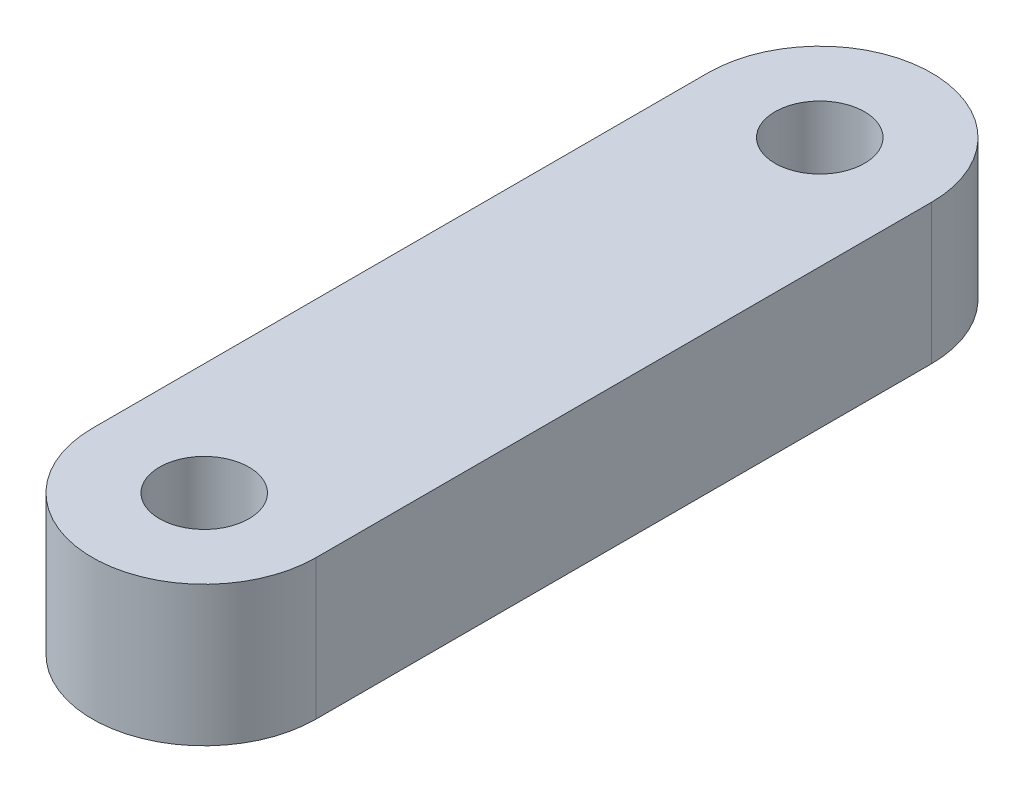
ISO-10303-21;
HEADER;
FILE_DESCRIPTION(('STEP AP214'),'2;1');
FILE_NAME('part.step','',(''),(''),'','','');
FILE_SCHEMA(('AUTOMOTIVE_DESIGN { 1 0 10303 214 1 1 1 1 }'));
ENDSEC;
DATA;
#1=APPLICATION_CONTEXT('core data for automotive mechanical design processes');
#2=APPLICATION_PROTOCOL_DEFINITION('international standard','automotive_design',2000,#1);
#3=PRODUCT_CONTEXT('',#1,'mechanical');
#4=PRODUCT('Part','Part','',(#3));
#5=PRODUCT_RELATED_PRODUCT_CATEGORY('part','',(#4));
#6=PRODUCT_DEFINITION_FORMATION('','',#4);
#7=PRODUCT_DEFINITION_CONTEXT('part definition',#1,'design');
#8=PRODUCT_DEFINITION('design','',#6,#7);
#9=PRODUCT_DEFINITION_SHAPE('','',#8);
#10=(LENGTH_UNIT() NAMED_UNIT(*) SI_UNIT(.MILLI.,.METRE.));
#11=(NAMED_UNIT(*) PLANE_ANGLE_UNIT() SI_UNIT($,.RADIAN.));
#12=(NAMED_UNIT(*) SI_UNIT($,.STERADIAN.) SOLID_ANGLE_UNIT());
#13=UNCERTAINTY_MEASURE_WITH_UNIT(LENGTH_MEASURE(1.E-05),#10,'distance_accuracy_value','');
#14=(GEOMETRIC_REPRESENTATION_CONTEXT(3) GLOBAL_UNCERTAINTY_ASSIGNED_CONTEXT((#13)) GLOBAL_UNIT_ASSIGNED_CONTEXT((#10,
#11,#12)) REPRESENTATION_CONTEXT('',''));
#15=CARTESIAN_POINT('',(0.,0.,0.));
#16=DIRECTION('',(0.,0.,1.));
#17=DIRECTION('',(1.,0.,0.));
#18=AXIS2_PLACEMENT_3D('',#15,#16,#17);
#19=CARTESIAN_POINT('',(0.,5.,11.));
#20=DIRECTION('',(0.,1.,0.));
#21=DIRECTION('',(0.,0.,1.));
#22=AXIS2_PLACEMENT_3D('',#19,#20,#21);
#23=PLANE('',#22);
#24=CARTESIAN_POINT('',(0.,5.,-11.));
#25=DIRECTION('',(0.,1.,0.));
#26=DIRECTION('',(0.,0.,1.));
#27=AXIS2_PLACEMENT_3D('',#24,#25,#26);
#28=CIRCLE('',#27,1.6);
#29=CARTESIAN_POINT('',(0.,5.,-9.4));
#30=VERTEX_POINT('',#29);
#31=EDGE_CURVE('E107',#30,#30,#28,.T.);
#32=ORIENTED_EDGE('',*,*,#31,.F.);
#33=EDGE_LOOP('',(#32));
#34=FACE_BOUND('',#33,.T.);
#35=CARTESIAN_POINT('',(0.,5.,11.));
#36=DIRECTION('',(0.,1.,0.));
#37=DIRECTION('',(0.,0.,1.));
#38=AXIS2_PLACEMENT_3D('',#35,#36,#37);
#39=CIRCLE('',#38,4.);
#40=CARTESIAN_POINT('',(-4.,5.,11.));
#41=VERTEX_POINT('',#40);
#42=CARTESIAN_POINT('',(4.,5.,11.));
#43=VERTEX_POINT('',#42);
#44=EDGE_CURVE('E92',#41,#43,#39,.T.);
#45=ORIENTED_EDGE('',*,*,#44,.T.);
#46=DIRECTION('',(0.,0.,-1.));
#47=VECTOR('',#46,1.);
#48=CARTESIAN_POINT('',(4.,5.,11.));
#49=LINE('',#48,#47);
#50=CARTESIAN_POINT('',(3.99999999999999,5.,-11.));
#51=VERTEX_POINT('',#50);
#52=EDGE_CURVE('E87',#43,#51,#49,.T.);
#53=ORIENTED_EDGE('',*,*,#52,.T.);
#54=CARTESIAN_POINT('',(0.,5.,-11.));
#55=DIRECTION('',(0.,1.,0.));
#56=DIRECTION('',(0.,0.,1.));
#57=AXIS2_PLACEMENT_3D('',#54,#55,#56);
#58=CIRCLE('',#57,3.99999999999999);
#59=CARTESIAN_POINT('',(-3.99999999999999,5.,-11.));
#60=VERTEX_POINT('',#59);
#61=EDGE_CURVE('E90',#51,#60,#58,.T.);
#62=ORIENTED_EDGE('',*,*,#61,.T.);
#63=DIRECTION('',(0.,0.,1.));
#64=VECTOR('',#63,1.);
#65=CARTESIAN_POINT('',(-4.,5.,11.));
#66=LINE('',#65,#64);
#67=EDGE_CURVE('E57',#60,#41,#66,.T.);
#68=ORIENTED_EDGE('',*,*,#67,.T.);
#69=EDGE_LOOP('',(#45,#53,#62,#68));
#70=FACE_BOUND('',#69,.T.);
#71=CARTESIAN_POINT('',(0.,5.,11.));
#72=DIRECTION('',(0.,1.,0.));
#73=DIRECTION('',(0.,0.,1.));
#74=AXIS2_PLACEMENT_3D('',#71,#72,#73);
#75=CIRCLE('',#74,1.6);
#76=CARTESIAN_POINT('',(0.,5.,12.6));
#77=VERTEX_POINT('',#76);
#78=EDGE_CURVE('E122',#77,#77,#75,.T.);
#79=ORIENTED_EDGE('',*,*,#78,.F.);
#80=EDGE_LOOP('',(#79));
#81=FACE_BOUND('',#80,.T.);
#82=ADVANCED_FACE('F40',(#34,#70,#81),#23,.T.);
#83=CARTESIAN_POINT('',(0.,0.,11.));
#84=DIRECTION('',(0.,1.,0.));
#85=DIRECTION('',(0.,0.,1.));
#86=AXIS2_PLACEMENT_3D('',#83,#84,#85);
#87=PLANE('',#86);
#88=CARTESIAN_POINT('',(0.,0.,11.));
#89=DIRECTION('',(0.,1.,0.));
#90=DIRECTION('',(0.,0.,1.));
#91=AXIS2_PLACEMENT_3D('',#88,#89,#90);
#92=CIRCLE('',#91,4.);
#93=CARTESIAN_POINT('',(-4.,0.,11.));
#94=VERTEX_POINT('',#93);
#95=CARTESIAN_POINT('',(4.,0.,11.));
#96=VERTEX_POINT('',#95);
#97=EDGE_CURVE('E104',#94,#96,#92,.T.);
#98=ORIENTED_EDGE('',*,*,#97,.F.);
#99=DIRECTION('',(0.,0.,1.));
#100=VECTOR('',#99,1.);
#101=CARTESIAN_POINT('',(-4.,0.,11.));
#102=LINE('',#101,#100);
#103=CARTESIAN_POINT('',(-3.99999999999999,0.,-11.));
#104=VERTEX_POINT('',#103);
#105=EDGE_CURVE('E80',#104,#94,#102,.T.);
#106=ORIENTED_EDGE('',*,*,#105,.F.);
#107=CARTESIAN_POINT('',(0.,0.,-11.));
#108=DIRECTION('',(0.,1.,0.));
#109=DIRECTION('',(0.,0.,1.));
#110=AXIS2_PLACEMENT_3D('',#107,#108,#109);
#111=CIRCLE('',#110,3.99999999999999);
#112=CARTESIAN_POINT('',(3.99999999999999,0.,-11.));
#113=VERTEX_POINT('',#112);
#114=EDGE_CURVE('E74',#113,#104,#111,.T.);
#115=ORIENTED_EDGE('',*,*,#114,.F.);
#116=DIRECTION('',(0.,0.,-1.));
#117=VECTOR('',#116,1.);
#118=CARTESIAN_POINT('',(4.,0.,11.));
#119=LINE('',#118,#117);
#120=EDGE_CURVE('E96',#96,#113,#119,.T.);
#121=ORIENTED_EDGE('',*,*,#120,.F.);
#122=EDGE_LOOP('',(#98,#106,#115,#121));
#123=FACE_BOUND('',#122,.T.);
#124=CARTESIAN_POINT('',(0.,0.,-11.));
#125=DIRECTION('',(0.,1.,0.));
#126=DIRECTION('',(0.,0.,1.));
#127=AXIS2_PLACEMENT_3D('',#124,#125,#126);
#128=CIRCLE('',#127,1.6);
#129=CARTESIAN_POINT('',(0.,0.,-9.4));
#130=VERTEX_POINT('',#129);
#131=EDGE_CURVE('E119',#130,#130,#128,.T.);
#132=ORIENTED_EDGE('',*,*,#131,.T.);
#133=EDGE_LOOP('',(#132));
#134=FACE_BOUND('',#133,.T.);
#135=CARTESIAN_POINT('',(0.,0.,11.));
#136=DIRECTION('',(0.,1.,0.));
#137=DIRECTION('',(0.,0.,1.));
#138=AXIS2_PLACEMENT_3D('',#135,#136,#137);
#139=CIRCLE('',#138,1.6);
#140=CARTESIAN_POINT('',(0.,0.,12.6));
#141=VERTEX_POINT('',#140);
#142=EDGE_CURVE('E125',#141,#141,#139,.T.);
#143=ORIENTED_EDGE('',*,*,#142,.T.);
#144=EDGE_LOOP('',(#143));
#145=FACE_BOUND('',#144,.T.);
#146=ADVANCED_FACE('F115',(#123,#134,#145),#87,.F.);
#147=CARTESIAN_POINT('',(0.,5.,11.));
#148=DIRECTION('',(0.,-1.,0.));
#149=DIRECTION('',(0.,0.,-1.));
#150=AXIS2_PLACEMENT_3D('',#147,#148,#149);
#151=CYLINDRICAL_SURFACE('',#150,4.);
#152=ORIENTED_EDGE('',*,*,#97,.T.);
#153=DIRECTION('',(0.,-1.,0.));
#154=VECTOR('',#153,1.);
#155=CARTESIAN_POINT('',(4.,5.,11.));
#156=LINE('',#155,#154);
#157=EDGE_CURVE('E11',#43,#96,#156,.T.);
#158=ORIENTED_EDGE('',*,*,#157,.F.);
#159=ORIENTED_EDGE('',*,*,#44,.F.);
#160=DIRECTION('',(0.,-1.,0.));
#161=VECTOR('',#160,1.);
#162=CARTESIAN_POINT('',(-4.,5.,11.));
#163=LINE('',#162,#161);
#164=EDGE_CURVE('E100',#41,#94,#163,.T.);
#165=ORIENTED_EDGE('',*,*,#164,.T.);
#166=EDGE_LOOP('',(#152,#158,#159,#165));
#167=FACE_BOUND('',#166,.T.);
#168=ADVANCED_FACE('F42',(#167),#151,.T.);
#169=CARTESIAN_POINT('',(4.,5.,11.));
#170=DIRECTION('',(-1.,0.,0.));
#171=DIRECTION('',(0.,0.,1.));
#172=AXIS2_PLACEMENT_3D('',#169,#170,#171);
#173=PLANE('',#172);
#174=ORIENTED_EDGE('',*,*,#120,.T.);
#175=DIRECTION('',(0.,-1.,0.));
#176=VECTOR('',#175,1.);
#177=CARTESIAN_POINT('',(3.99999999999999,5.,-11.));
#178=LINE('',#177,#176);
#179=EDGE_CURVE('E49',#51,#113,#178,.T.);
#180=ORIENTED_EDGE('',*,*,#179,.F.);
#181=ORIENTED_EDGE('',*,*,#52,.F.);
#182=ORIENTED_EDGE('',*,*,#157,.T.);
#183=EDGE_LOOP('',(#174,#180,#181,#182));
#184=FACE_BOUND('',#183,.T.);
#185=ADVANCED_FACE('F95',(#184),#173,.F.);
#186=CARTESIAN_POINT('',(0.,5.,-11.));
#187=DIRECTION('',(0.,-1.,0.));
#188=DIRECTION('',(0.,0.,-1.));
#189=AXIS2_PLACEMENT_3D('',#186,#187,#188);
#190=CYLINDRICAL_SURFACE('',#189,3.99999999999999);
#191=ORIENTED_EDGE('',*,*,#114,.T.);
#192=DIRECTION('',(0.,-1.,0.));
#193=VECTOR('',#192,1.);
#194=CARTESIAN_POINT('',(-3.99999999999999,5.,-11.));
#195=LINE('',#194,#193);
#196=EDGE_CURVE('E97',#60,#104,#195,.T.);
#197=ORIENTED_EDGE('',*,*,#196,.F.);
#198=ORIENTED_EDGE('',*,*,#61,.F.);
#199=ORIENTED_EDGE('',*,*,#179,.T.);
#200=EDGE_LOOP('',(#191,#197,#198,#199));
#201=FACE_BOUND('',#200,.T.);
#202=ADVANCED_FACE('F98',(#201),#190,.T.);
#203=CARTESIAN_POINT('',(-4.,5.,11.));
#204=DIRECTION('',(1.,0.,0.));
#205=DIRECTION('',(0.,0.,-1.));
#206=AXIS2_PLACEMENT_3D('',#203,#204,#205);
#207=PLANE('',#206);
#208=ORIENTED_EDGE('',*,*,#105,.T.);
#209=ORIENTED_EDGE('',*,*,#164,.F.);
#210=ORIENTED_EDGE('',*,*,#67,.F.);
#211=ORIENTED_EDGE('',*,*,#196,.T.);
#212=EDGE_LOOP('',(#208,#209,#210,#211));
#213=FACE_BOUND('',#212,.T.);
#214=ADVANCED_FACE('F112',(#213),#207,.F.);
#215=CARTESIAN_POINT('',(0.,5.,-11.));
#216=DIRECTION('',(0.,-1.,0.));
#217=DIRECTION('',(0.,0.,-1.));
#218=AXIS2_PLACEMENT_3D('',#215,#216,#217);
#219=CYLINDRICAL_SURFACE('',#218,1.6);
#220=ORIENTED_EDGE('',*,*,#31,.T.);
#221=EDGE_LOOP('',(#220));
#222=FACE_BOUND('',#221,.T.);
#223=ORIENTED_EDGE('',*,*,#131,.F.);
#224=EDGE_LOOP('',(#223));
#225=FACE_BOUND('',#224,.T.);
#226=ADVANCED_FACE('F142',(#222,#225),#219,.F.);
#227=CARTESIAN_POINT('',(0.,5.,11.));
#228=DIRECTION('',(0.,-1.,0.));
#229=DIRECTION('',(0.,0.,-1.));
#230=AXIS2_PLACEMENT_3D('',#227,#228,#229);
#231=CYLINDRICAL_SURFACE('',#230,1.6);
#232=ORIENTED_EDGE('',*,*,#78,.T.);
#233=EDGE_LOOP('',(#232));
#234=FACE_BOUND('',#233,.T.);
#235=ORIENTED_EDGE('',*,*,#142,.F.);
#236=EDGE_LOOP('',(#235));
#237=FACE_BOUND('',#236,.T.);
#238=ADVANCED_FACE('F131',(#234,#237),#231,.F.);
#239=CLOSED_SHELL('',(#82,#146,#168,#185,#202,#214,#226,#238));
#240=MANIFOLD_SOLID_BREP('B2',#239);
#241=ADVANCED_BREP_SHAPE_REPRESENTATION('',(#18,#240),#14);
#242=SHAPE_DEFINITION_REPRESENTATION(#9,#241);
ENDSEC;
END-ISO-10303-21;
